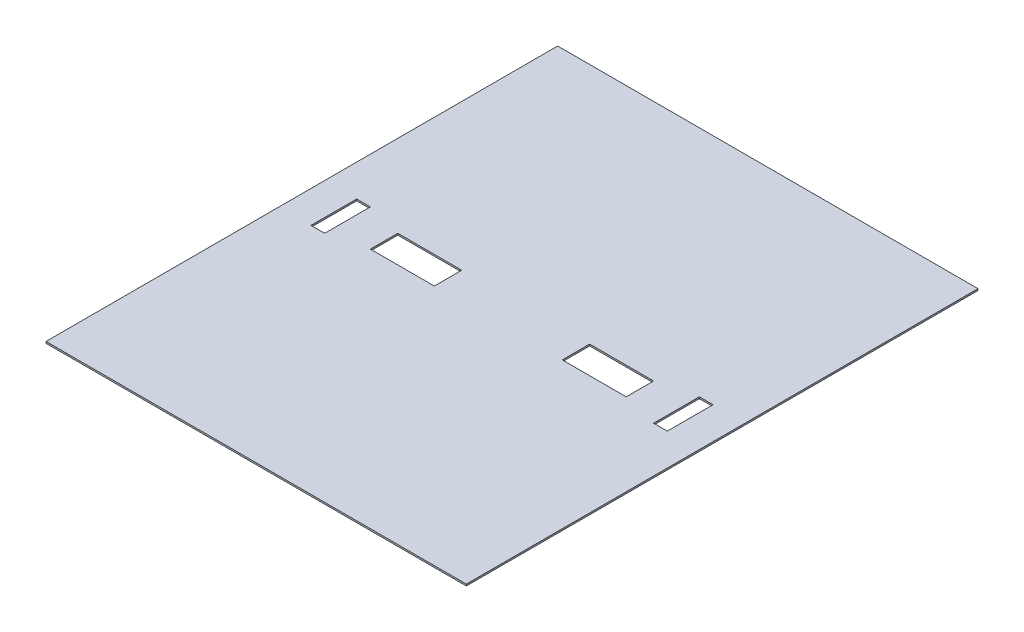
ISO-10303-21;
HEADER;
FILE_DESCRIPTION(('STEP AP214'),'2;1');
FILE_NAME('part.step','',(''),(''),'','','');
FILE_SCHEMA(('AUTOMOTIVE_DESIGN { 1 0 10303 214 1 1 1 1 }'));
ENDSEC;
DATA;
#1=APPLICATION_CONTEXT('core data for automotive mechanical design processes');
#2=APPLICATION_PROTOCOL_DEFINITION('international standard','automotive_design',2000,#1);
#3=PRODUCT_CONTEXT('',#1,'mechanical');
#4=PRODUCT('Part','Part','',(#3));
#5=PRODUCT_RELATED_PRODUCT_CATEGORY('part','',(#4));
#6=PRODUCT_DEFINITION_FORMATION('','',#4);
#7=PRODUCT_DEFINITION_CONTEXT('part definition',#1,'design');
#8=PRODUCT_DEFINITION('design','',#6,#7);
#9=PRODUCT_DEFINITION_SHAPE('','',#8);
#10=(LENGTH_UNIT() NAMED_UNIT(*) SI_UNIT(.MILLI.,.METRE.));
#11=(NAMED_UNIT(*) PLANE_ANGLE_UNIT() SI_UNIT($,.RADIAN.));
#12=(NAMED_UNIT(*) SI_UNIT($,.STERADIAN.) SOLID_ANGLE_UNIT());
#13=UNCERTAINTY_MEASURE_WITH_UNIT(LENGTH_MEASURE(1.E-05),#10,'distance_accuracy_value','');
#14=(GEOMETRIC_REPRESENTATION_CONTEXT(3) GLOBAL_UNCERTAINTY_ASSIGNED_CONTEXT((#13)) GLOBAL_UNIT_ASSIGNED_CONTEXT((#10,
#11,#12)) REPRESENTATION_CONTEXT('',''));
#15=CARTESIAN_POINT('',(0.,0.,0.));
#16=DIRECTION('',(0.,0.,1.));
#17=DIRECTION('',(1.,0.,0.));
#18=AXIS2_PLACEMENT_3D('',#15,#16,#17);
#19=CARTESIAN_POINT('',(0.,-27.6859999999999,0.));
#20=DIRECTION('',(0.,-1.,0.));
#21=DIRECTION('',(0.,0.,-1.));
#22=AXIS2_PLACEMENT_3D('',#19,#20,#21);
#23=PLANE('',#22);
#24=DIRECTION('',(0.,0.,-1.));
#25=VECTOR('',#24,1.);
#26=CARTESIAN_POINT('',(-247.65,-27.6859999999999,31.75));
#27=LINE('',#26,#25);
#28=CARTESIAN_POINT('',(-247.65,-27.6859999999999,31.75));
#29=VERTEX_POINT('',#28);
#30=CARTESIAN_POINT('',(-247.65,-27.6859999999999,-31.75));
#31=VERTEX_POINT('',#30);
#32=EDGE_CURVE('E255',#29,#31,#27,.T.);
#33=ORIENTED_EDGE('',*,*,#32,.F.);
#34=DIRECTION('',(-1.,0.,0.));
#35=VECTOR('',#34,1.);
#36=CARTESIAN_POINT('',(-247.65,-27.6859999999999,31.75));
#37=LINE('',#36,#35);
#38=CARTESIAN_POINT('',(-228.6,-27.6859999999999,31.75));
#39=VERTEX_POINT('',#38);
#40=EDGE_CURVE('E245',#39,#29,#37,.T.);
#41=ORIENTED_EDGE('',*,*,#40,.F.);
#42=DIRECTION('',(0.,0.,1.));
#43=VECTOR('',#42,1.);
#44=CARTESIAN_POINT('',(-228.6,-27.6859999999999,31.75));
#45=LINE('',#44,#43);
#46=CARTESIAN_POINT('',(-228.6,-27.6859999999999,-31.75));
#47=VERTEX_POINT('',#46);
#48=EDGE_CURVE('E261',#47,#39,#45,.T.);
#49=ORIENTED_EDGE('',*,*,#48,.F.);
#50=DIRECTION('',(1.,0.,0.));
#51=VECTOR('',#50,1.);
#52=CARTESIAN_POINT('',(-247.65,-27.6859999999999,-31.75));
#53=LINE('',#52,#51);
#54=EDGE_CURVE('E257',#31,#47,#53,.T.);
#55=ORIENTED_EDGE('',*,*,#54,.F.);
#56=EDGE_LOOP('',(#33,#41,#49,#55));
#57=FACE_BOUND('',#56,.T.);
#58=DIRECTION('',(0.,0.,-1.));
#59=VECTOR('',#58,1.);
#60=CARTESIAN_POINT('',(-177.8,-27.6859999999999,19.05));
#61=LINE('',#60,#59);
#62=CARTESIAN_POINT('',(-177.8,-27.6859999999999,19.05));
#63=VERTEX_POINT('',#62);
#64=CARTESIAN_POINT('',(-177.8,-27.6859999999999,-19.05));
#65=VERTEX_POINT('',#64);
#66=EDGE_CURVE('E211',#63,#65,#61,.T.);
#67=ORIENTED_EDGE('',*,*,#66,.F.);
#68=DIRECTION('',(-1.,0.,0.));
#69=VECTOR('',#68,1.);
#70=CARTESIAN_POINT('',(-177.8,-27.6859999999999,19.05));
#71=LINE('',#70,#69);
#72=CARTESIAN_POINT('',(-88.8999999999999,-27.6859999999999,19.05));
#73=VERTEX_POINT('',#72);
#74=EDGE_CURVE('E279',#73,#63,#71,.T.);
#75=ORIENTED_EDGE('',*,*,#74,.F.);
#76=DIRECTION('',(0.,0.,1.));
#77=VECTOR('',#76,1.);
#78=CARTESIAN_POINT('',(-88.8999999999999,-27.6859999999999,19.05));
#79=LINE('',#78,#77);
#80=CARTESIAN_POINT('',(-88.8999999999999,-27.6859999999999,-19.05));
#81=VERTEX_POINT('',#80);
#82=EDGE_CURVE('E293',#81,#73,#79,.T.);
#83=ORIENTED_EDGE('',*,*,#82,.F.);
#84=DIRECTION('',(1.,0.,0.));
#85=VECTOR('',#84,1.);
#86=CARTESIAN_POINT('',(-177.8,-27.6859999999999,-19.05));
#87=LINE('',#86,#85);
#88=EDGE_CURVE('E290',#65,#81,#87,.T.);
#89=ORIENTED_EDGE('',*,*,#88,.F.);
#90=EDGE_LOOP('',(#67,#75,#83,#89));
#91=FACE_BOUND('',#90,.T.);
#92=DIRECTION('',(0.,0.,1.));
#93=VECTOR('',#92,1.);
#94=CARTESIAN_POINT('',(-292.1,-27.6859999999999,-355.6));
#95=LINE('',#94,#93);
#96=CARTESIAN_POINT('',(-292.1,-27.6859999999999,-355.6));
#97=VERTEX_POINT('',#96);
#98=CARTESIAN_POINT('',(-292.1,-27.6859999999999,355.6));
#99=VERTEX_POINT('',#98);
#100=EDGE_CURVE('E305',#97,#99,#95,.T.);
#101=ORIENTED_EDGE('',*,*,#100,.F.);
#102=DIRECTION('',(-1.,0.,0.));
#103=VECTOR('',#102,1.);
#104=CARTESIAN_POINT('',(292.1,-27.6859999999999,-355.6));
#105=LINE('',#104,#103);
#106=CARTESIAN_POINT('',(292.1,-27.6859999999999,-355.6));
#107=VERTEX_POINT('',#106);
#108=EDGE_CURVE('E315',#107,#97,#105,.T.);
#109=ORIENTED_EDGE('',*,*,#108,.F.);
#110=DIRECTION('',(0.,0.,-1.));
#111=VECTOR('',#110,1.);
#112=CARTESIAN_POINT('',(292.1,-27.6859999999999,-355.6));
#113=LINE('',#112,#111);
#114=CARTESIAN_POINT('',(292.1,-27.6859999999999,355.6));
#115=VERTEX_POINT('',#114);
#116=EDGE_CURVE('E312',#115,#107,#113,.T.);
#117=ORIENTED_EDGE('',*,*,#116,.F.);
#118=DIRECTION('',(1.,0.,0.));
#119=VECTOR('',#118,1.);
#120=CARTESIAN_POINT('',(292.1,-27.6859999999999,355.6));
#121=LINE('',#120,#119);
#122=EDGE_CURVE('E308',#99,#115,#121,.T.);
#123=ORIENTED_EDGE('',*,*,#122,.F.);
#124=EDGE_LOOP('',(#101,#109,#117,#123));
#125=FACE_BOUND('',#124,.T.);
#126=DIRECTION('',(1.,0.,0.));
#127=VECTOR('',#126,1.);
#128=CARTESIAN_POINT('',(177.8,-27.6859999999999,19.05));
#129=LINE('',#128,#127);
#130=CARTESIAN_POINT('',(88.8999999999999,-27.6859999999999,19.05));
#131=VERTEX_POINT('',#130);
#132=CARTESIAN_POINT('',(177.8,-27.6859999999999,19.05));
#133=VERTEX_POINT('',#132);
#134=EDGE_CURVE('E227',#131,#133,#129,.T.);
#135=ORIENTED_EDGE('',*,*,#134,.T.);
#136=DIRECTION('',(0.,0.,-1.));
#137=VECTOR('',#136,1.);
#138=CARTESIAN_POINT('',(177.8,-27.6859999999999,19.05));
#139=LINE('',#138,#137);
#140=CARTESIAN_POINT('',(177.8,-27.6859999999999,-19.05));
#141=VERTEX_POINT('',#140);
#142=EDGE_CURVE('E60',#133,#141,#139,.T.);
#143=ORIENTED_EDGE('',*,*,#142,.T.);
#144=DIRECTION('',(-1.,0.,0.));
#145=VECTOR('',#144,1.);
#146=CARTESIAN_POINT('',(177.8,-27.6859999999999,-19.05));
#147=LINE('',#146,#145);
#148=CARTESIAN_POINT('',(88.8999999999999,-27.6859999999999,-19.05));
#149=VERTEX_POINT('',#148);
#150=EDGE_CURVE('E218',#141,#149,#147,.T.);
#151=ORIENTED_EDGE('',*,*,#150,.T.);
#152=DIRECTION('',(0.,0.,1.));
#153=VECTOR('',#152,1.);
#154=CARTESIAN_POINT('',(88.8999999999999,-27.6859999999999,19.05));
#155=LINE('',#154,#153);
#156=EDGE_CURVE('E230',#149,#131,#155,.T.);
#157=ORIENTED_EDGE('',*,*,#156,.T.);
#158=EDGE_LOOP('',(#135,#143,#151,#157));
#159=FACE_BOUND('',#158,.T.);
#160=DIRECTION('',(1.,0.,0.));
#161=VECTOR('',#160,1.);
#162=CARTESIAN_POINT('',(247.65,-27.6859999999999,31.75));
#163=LINE('',#162,#161);
#164=CARTESIAN_POINT('',(228.6,-27.6859999999999,31.75));
#165=VERTEX_POINT('',#164);
#166=CARTESIAN_POINT('',(247.65,-27.6859999999999,31.75));
#167=VERTEX_POINT('',#166);
#168=EDGE_CURVE('E204',#165,#167,#163,.T.);
#169=ORIENTED_EDGE('',*,*,#168,.T.);
#170=DIRECTION('',(0.,0.,-1.));
#171=VECTOR('',#170,1.);
#172=CARTESIAN_POINT('',(247.65,-27.6859999999999,31.75));
#173=LINE('',#172,#171);
#174=CARTESIAN_POINT('',(247.65,-27.6859999999999,-31.75));
#175=VERTEX_POINT('',#174);
#176=EDGE_CURVE('E52',#167,#175,#173,.T.);
#177=ORIENTED_EDGE('',*,*,#176,.T.);
#178=DIRECTION('',(-1.,0.,0.));
#179=VECTOR('',#178,1.);
#180=CARTESIAN_POINT('',(247.65,-27.6859999999999,-31.75));
#181=LINE('',#180,#179);
#182=CARTESIAN_POINT('',(228.6,-27.6859999999999,-31.75));
#183=VERTEX_POINT('',#182);
#184=EDGE_CURVE('E195',#175,#183,#181,.T.);
#185=ORIENTED_EDGE('',*,*,#184,.T.);
#186=DIRECTION('',(0.,0.,1.));
#187=VECTOR('',#186,1.);
#188=CARTESIAN_POINT('',(228.6,-27.6859999999999,31.75));
#189=LINE('',#188,#187);
#190=EDGE_CURVE('E198',#183,#165,#189,.T.);
#191=ORIENTED_EDGE('',*,*,#190,.T.);
#192=EDGE_LOOP('',(#169,#177,#185,#191));
#193=FACE_BOUND('',#192,.T.);
#194=ADVANCED_FACE('F35',(#57,#91,#125,#159,#193),#23,.T.);
#195=CARTESIAN_POINT('',(0.,-25.3999999999999,0.));
#196=DIRECTION('',(0.,-1.,0.));
#197=DIRECTION('',(0.,0.,-1.));
#198=AXIS2_PLACEMENT_3D('',#195,#196,#197);
#199=PLANE('',#198);
#200=DIRECTION('',(0.,0.,-1.));
#201=VECTOR('',#200,1.);
#202=CARTESIAN_POINT('',(177.8,-25.3999999999999,19.05));
#203=LINE('',#202,#201);
#204=CARTESIAN_POINT('',(177.8,-25.3999999999999,19.05));
#205=VERTEX_POINT('',#204);
#206=CARTESIAN_POINT('',(177.8,-25.3999999999999,-19.05));
#207=VERTEX_POINT('',#206);
#208=EDGE_CURVE('E215',#205,#207,#203,.T.);
#209=ORIENTED_EDGE('',*,*,#208,.F.);
#210=DIRECTION('',(1.,0.,0.));
#211=VECTOR('',#210,1.);
#212=CARTESIAN_POINT('',(177.8,-25.3999999999999,19.05));
#213=LINE('',#212,#211);
#214=CARTESIAN_POINT('',(88.8999999999999,-25.3999999999999,19.05));
#215=VERTEX_POINT('',#214);
#216=EDGE_CURVE('E217',#215,#205,#213,.T.);
#217=ORIENTED_EDGE('',*,*,#216,.F.);
#218=DIRECTION('',(0.,0.,1.));
#219=VECTOR('',#218,1.);
#220=CARTESIAN_POINT('',(88.8999999999999,-25.3999999999999,19.05));
#221=LINE('',#220,#219);
#222=CARTESIAN_POINT('',(88.8999999999999,-25.3999999999999,-19.05));
#223=VERTEX_POINT('',#222);
#224=EDGE_CURVE('E220',#223,#215,#221,.T.);
#225=ORIENTED_EDGE('',*,*,#224,.F.);
#226=DIRECTION('',(-1.,0.,0.));
#227=VECTOR('',#226,1.);
#228=CARTESIAN_POINT('',(177.8,-25.3999999999999,-19.05));
#229=LINE('',#228,#227);
#230=EDGE_CURVE('E223',#207,#223,#229,.T.);
#231=ORIENTED_EDGE('',*,*,#230,.F.);
#232=EDGE_LOOP('',(#209,#217,#225,#231));
#233=FACE_BOUND('',#232,.T.);
#234=DIRECTION('',(-1.,0.,0.));
#235=VECTOR('',#234,1.);
#236=CARTESIAN_POINT('',(-247.65,-25.3999999999999,31.75));
#237=LINE('',#236,#235);
#238=CARTESIAN_POINT('',(-228.6,-25.3999999999999,31.75));
#239=VERTEX_POINT('',#238);
#240=CARTESIAN_POINT('',(-247.65,-25.3999999999999,31.75));
#241=VERTEX_POINT('',#240);
#242=EDGE_CURVE('E251',#239,#241,#237,.T.);
#243=ORIENTED_EDGE('',*,*,#242,.T.);
#244=DIRECTION('',(0.,0.,-1.));
#245=VECTOR('',#244,1.);
#246=CARTESIAN_POINT('',(-247.65,-25.3999999999999,31.75));
#247=LINE('',#246,#245);
#248=CARTESIAN_POINT('',(-247.65,-25.3999999999999,-31.75));
#249=VERTEX_POINT('',#248);
#250=EDGE_CURVE('E241',#241,#249,#247,.T.);
#251=ORIENTED_EDGE('',*,*,#250,.T.);
#252=DIRECTION('',(1.,0.,0.));
#253=VECTOR('',#252,1.);
#254=CARTESIAN_POINT('',(-247.65,-25.3999999999999,-31.75));
#255=LINE('',#254,#253);
#256=CARTESIAN_POINT('',(-228.6,-25.3999999999999,-31.75));
#257=VERTEX_POINT('',#256);
#258=EDGE_CURVE('E244',#249,#257,#255,.T.);
#259=ORIENTED_EDGE('',*,*,#258,.T.);
#260=DIRECTION('',(0.,0.,1.));
#261=VECTOR('',#260,1.);
#262=CARTESIAN_POINT('',(-228.6,-25.3999999999999,31.75));
#263=LINE('',#262,#261);
#264=EDGE_CURVE('E248',#257,#239,#263,.T.);
#265=ORIENTED_EDGE('',*,*,#264,.T.);
#266=EDGE_LOOP('',(#243,#251,#259,#265));
#267=FACE_BOUND('',#266,.T.);
#268=DIRECTION('',(-1.,0.,0.));
#269=VECTOR('',#268,1.);
#270=CARTESIAN_POINT('',(-177.8,-25.3999999999999,19.05));
#271=LINE('',#270,#269);
#272=CARTESIAN_POINT('',(-88.8999999999999,-25.3999999999999,19.05));
#273=VERTEX_POINT('',#272);
#274=CARTESIAN_POINT('',(-177.8,-25.3999999999999,19.05));
#275=VERTEX_POINT('',#274);
#276=EDGE_CURVE('E285',#273,#275,#271,.T.);
#277=ORIENTED_EDGE('',*,*,#276,.T.);
#278=DIRECTION('',(0.,0.,-1.));
#279=VECTOR('',#278,1.);
#280=CARTESIAN_POINT('',(-177.8,-25.3999999999999,19.05));
#281=LINE('',#280,#279);
#282=CARTESIAN_POINT('',(-177.8,-25.3999999999999,-19.05));
#283=VERTEX_POINT('',#282);
#284=EDGE_CURVE('E275',#275,#283,#281,.T.);
#285=ORIENTED_EDGE('',*,*,#284,.T.);
#286=DIRECTION('',(1.,0.,0.));
#287=VECTOR('',#286,1.);
#288=CARTESIAN_POINT('',(-177.8,-25.3999999999999,-19.05));
#289=LINE('',#288,#287);
#290=CARTESIAN_POINT('',(-88.8999999999999,-25.3999999999999,-19.05));
#291=VERTEX_POINT('',#290);
#292=EDGE_CURVE('E278',#283,#291,#289,.T.);
#293=ORIENTED_EDGE('',*,*,#292,.T.);
#294=DIRECTION('',(0.,0.,1.));
#295=VECTOR('',#294,1.);
#296=CARTESIAN_POINT('',(-88.8999999999999,-25.3999999999999,19.05));
#297=LINE('',#296,#295);
#298=EDGE_CURVE('E282',#291,#273,#297,.T.);
#299=ORIENTED_EDGE('',*,*,#298,.T.);
#300=EDGE_LOOP('',(#277,#285,#293,#299));
#301=FACE_BOUND('',#300,.T.);
#302=DIRECTION('',(0.,0.,1.));
#303=VECTOR('',#302,1.);
#304=CARTESIAN_POINT('',(-292.1,-25.3999999999999,-355.6));
#305=LINE('',#304,#303);
#306=CARTESIAN_POINT('',(-292.1,-25.3999999999999,-355.6));
#307=VERTEX_POINT('',#306);
#308=CARTESIAN_POINT('',(-292.1,-25.3999999999999,355.6));
#309=VERTEX_POINT('',#308);
#310=EDGE_CURVE('E268',#307,#309,#305,.T.);
#311=ORIENTED_EDGE('',*,*,#310,.T.);
#312=DIRECTION('',(1.,0.,0.));
#313=VECTOR('',#312,1.);
#314=CARTESIAN_POINT('',(292.1,-25.3999999999999,355.6));
#315=LINE('',#314,#313);
#316=CARTESIAN_POINT('',(292.1,-25.3999999999999,355.6));
#317=VERTEX_POINT('',#316);
#318=EDGE_CURVE('E320',#309,#317,#315,.T.);
#319=ORIENTED_EDGE('',*,*,#318,.T.);
#320=DIRECTION('',(0.,0.,-1.));
#321=VECTOR('',#320,1.);
#322=CARTESIAN_POINT('',(292.1,-25.3999999999999,-355.6));
#323=LINE('',#322,#321);
#324=CARTESIAN_POINT('',(292.1,-25.3999999999999,-355.6));
#325=VERTEX_POINT('',#324);
#326=EDGE_CURVE('E323',#317,#325,#323,.T.);
#327=ORIENTED_EDGE('',*,*,#326,.T.);
#328=DIRECTION('',(-1.,0.,0.));
#329=VECTOR('',#328,1.);
#330=CARTESIAN_POINT('',(292.1,-25.3999999999999,-355.6));
#331=LINE('',#330,#329);
#332=EDGE_CURVE('E309',#325,#307,#331,.T.);
#333=ORIENTED_EDGE('',*,*,#332,.T.);
#334=EDGE_LOOP('',(#311,#319,#327,#333));
#335=FACE_BOUND('',#334,.T.);
#336=DIRECTION('',(0.,0.,-1.));
#337=VECTOR('',#336,1.);
#338=CARTESIAN_POINT('',(247.65,-25.3999999999999,31.75));
#339=LINE('',#338,#337);
#340=CARTESIAN_POINT('',(247.65,-25.3999999999999,31.75));
#341=VERTEX_POINT('',#340);
#342=CARTESIAN_POINT('',(247.65,-25.3999999999999,-31.75));
#343=VERTEX_POINT('',#342);
#344=EDGE_CURVE('E187',#341,#343,#339,.T.);
#345=ORIENTED_EDGE('',*,*,#344,.F.);
#346=DIRECTION('',(1.,0.,0.));
#347=VECTOR('',#346,1.);
#348=CARTESIAN_POINT('',(247.65,-25.3999999999999,31.75));
#349=LINE('',#348,#347);
#350=CARTESIAN_POINT('',(228.6,-25.3999999999999,31.75));
#351=VERTEX_POINT('',#350);
#352=EDGE_CURVE('E176',#351,#341,#349,.T.);
#353=ORIENTED_EDGE('',*,*,#352,.F.);
#354=DIRECTION('',(0.,0.,1.));
#355=VECTOR('',#354,1.);
#356=CARTESIAN_POINT('',(228.6,-25.3999999999999,31.75));
#357=LINE('',#356,#355);
#358=CARTESIAN_POINT('',(228.6,-25.3999999999999,-31.75));
#359=VERTEX_POINT('',#358);
#360=EDGE_CURVE('E186',#359,#351,#357,.T.);
#361=ORIENTED_EDGE('',*,*,#360,.F.);
#362=DIRECTION('',(-1.,0.,0.));
#363=VECTOR('',#362,1.);
#364=CARTESIAN_POINT('',(247.65,-25.3999999999999,-31.75));
#365=LINE('',#364,#363);
#366=EDGE_CURVE('E191',#343,#359,#365,.T.);
#367=ORIENTED_EDGE('',*,*,#366,.F.);
#368=EDGE_LOOP('',(#345,#353,#361,#367));
#369=FACE_BOUND('',#368,.T.);
#370=ADVANCED_FACE('F194',(#233,#267,#301,#335,#369),#199,.F.);
#371=CARTESIAN_POINT('',(-292.1,-27.6859999999999,-355.6));
#372=DIRECTION('',(-1.,0.,0.));
#373=DIRECTION('',(0.,0.,1.));
#374=AXIS2_PLACEMENT_3D('',#371,#372,#373);
#375=PLANE('',#374);
#376=ORIENTED_EDGE('',*,*,#310,.F.);
#377=DIRECTION('',(0.,1.,0.));
#378=VECTOR('',#377,1.);
#379=CARTESIAN_POINT('',(-292.1,-27.6859999999999,-355.6));
#380=LINE('',#379,#378);
#381=EDGE_CURVE('E11',#97,#307,#380,.T.);
#382=ORIENTED_EDGE('',*,*,#381,.F.);
#383=ORIENTED_EDGE('',*,*,#100,.T.);
#384=DIRECTION('',(0.,1.,0.));
#385=VECTOR('',#384,1.);
#386=CARTESIAN_POINT('',(-292.1,-27.6859999999999,355.6));
#387=LINE('',#386,#385);
#388=EDGE_CURVE('E39',#99,#309,#387,.T.);
#389=ORIENTED_EDGE('',*,*,#388,.T.);
#390=EDGE_LOOP('',(#376,#382,#383,#389));
#391=FACE_BOUND('',#390,.T.);
#392=ADVANCED_FACE('F37',(#391),#375,.T.);
#393=CARTESIAN_POINT('',(292.1,-27.6859999999999,-355.6));
#394=DIRECTION('',(0.,0.,-1.));
#395=DIRECTION('',(-1.,0.,0.));
#396=AXIS2_PLACEMENT_3D('',#393,#394,#395);
#397=PLANE('',#396);
#398=ORIENTED_EDGE('',*,*,#332,.F.);
#399=DIRECTION('',(0.,1.,0.));
#400=VECTOR('',#399,1.);
#401=CARTESIAN_POINT('',(292.1,-27.6859999999999,-355.6));
#402=LINE('',#401,#400);
#403=EDGE_CURVE('E44',#107,#325,#402,.T.);
#404=ORIENTED_EDGE('',*,*,#403,.F.);
#405=ORIENTED_EDGE('',*,*,#108,.T.);
#406=ORIENTED_EDGE('',*,*,#381,.T.);
#407=EDGE_LOOP('',(#398,#404,#405,#406));
#408=FACE_BOUND('',#407,.T.);
#409=ADVANCED_FACE('F340',(#408),#397,.T.);
#410=CARTESIAN_POINT('',(292.1,-27.6859999999999,-355.6));
#411=DIRECTION('',(1.,0.,0.));
#412=DIRECTION('',(0.,0.,-1.));
#413=AXIS2_PLACEMENT_3D('',#410,#411,#412);
#414=PLANE('',#413);
#415=ORIENTED_EDGE('',*,*,#326,.F.);
#416=DIRECTION('',(0.,1.,0.));
#417=VECTOR('',#416,1.);
#418=CARTESIAN_POINT('',(292.1,-27.6859999999999,355.6));
#419=LINE('',#418,#417);
#420=EDGE_CURVE('E328',#115,#317,#419,.T.);
#421=ORIENTED_EDGE('',*,*,#420,.F.);
#422=ORIENTED_EDGE('',*,*,#116,.T.);
#423=ORIENTED_EDGE('',*,*,#403,.T.);
#424=EDGE_LOOP('',(#415,#421,#422,#423));
#425=FACE_BOUND('',#424,.T.);
#426=ADVANCED_FACE('F346',(#425),#414,.T.);
#427=CARTESIAN_POINT('',(292.1,-27.6859999999999,355.6));
#428=DIRECTION('',(0.,0.,1.));
#429=DIRECTION('',(1.,0.,0.));
#430=AXIS2_PLACEMENT_3D('',#427,#428,#429);
#431=PLANE('',#430);
#432=ORIENTED_EDGE('',*,*,#318,.F.);
#433=ORIENTED_EDGE('',*,*,#388,.F.);
#434=ORIENTED_EDGE('',*,*,#122,.T.);
#435=ORIENTED_EDGE('',*,*,#420,.T.);
#436=EDGE_LOOP('',(#432,#433,#434,#435));
#437=FACE_BOUND('',#436,.T.);
#438=ADVANCED_FACE('F336',(#437),#431,.T.);
#439=CARTESIAN_POINT('',(-177.8,-25.3999999999999,19.05));
#440=DIRECTION('',(-1.,0.,0.));
#441=DIRECTION('',(0.,0.,1.));
#442=AXIS2_PLACEMENT_3D('',#439,#440,#441);
#443=PLANE('',#442);
#444=ORIENTED_EDGE('',*,*,#66,.T.);
#445=DIRECTION('',(0.,-1.,0.));
#446=VECTOR('',#445,1.);
#447=CARTESIAN_POINT('',(-177.8,-25.3999999999999,-19.05));
#448=LINE('',#447,#446);
#449=EDGE_CURVE('E288',#283,#65,#448,.T.);
#450=ORIENTED_EDGE('',*,*,#449,.F.);
#451=ORIENTED_EDGE('',*,*,#284,.F.);
#452=DIRECTION('',(0.,-1.,0.));
#453=VECTOR('',#452,1.);
#454=CARTESIAN_POINT('',(-177.8,-25.3999999999999,19.05));
#455=LINE('',#454,#453);
#456=EDGE_CURVE('E258',#275,#63,#455,.T.);
#457=ORIENTED_EDGE('',*,*,#456,.T.);
#458=EDGE_LOOP('',(#444,#450,#451,#457));
#459=FACE_BOUND('',#458,.T.);
#460=ADVANCED_FACE('F353',(#459),#443,.F.);
#461=CARTESIAN_POINT('',(-177.8,-25.3999999999999,19.05));
#462=DIRECTION('',(0.,0.,1.));
#463=DIRECTION('',(1.,0.,0.));
#464=AXIS2_PLACEMENT_3D('',#461,#462,#463);
#465=PLANE('',#464);
#466=ORIENTED_EDGE('',*,*,#74,.T.);
#467=ORIENTED_EDGE('',*,*,#456,.F.);
#468=ORIENTED_EDGE('',*,*,#276,.F.);
#469=DIRECTION('',(0.,-1.,0.));
#470=VECTOR('',#469,1.);
#471=CARTESIAN_POINT('',(-88.8999999999999,-25.3999999999999,19.05));
#472=LINE('',#471,#470);
#473=EDGE_CURVE('E299',#273,#73,#472,.T.);
#474=ORIENTED_EDGE('',*,*,#473,.T.);
#475=EDGE_LOOP('',(#466,#467,#468,#474));
#476=FACE_BOUND('',#475,.T.);
#477=ADVANCED_FACE('F368',(#476),#465,.F.);
#478=CARTESIAN_POINT('',(-88.8999999999999,-25.3999999999999,19.05));
#479=DIRECTION('',(1.,0.,0.));
#480=DIRECTION('',(0.,0.,-1.));
#481=AXIS2_PLACEMENT_3D('',#478,#479,#480);
#482=PLANE('',#481);
#483=ORIENTED_EDGE('',*,*,#82,.T.);
#484=ORIENTED_EDGE('',*,*,#473,.F.);
#485=ORIENTED_EDGE('',*,*,#298,.F.);
#486=DIRECTION('',(0.,-1.,0.));
#487=VECTOR('',#486,1.);
#488=CARTESIAN_POINT('',(-88.8999999999999,-25.3999999999999,-19.05));
#489=LINE('',#488,#487);
#490=EDGE_CURVE('E301',#291,#81,#489,.T.);
#491=ORIENTED_EDGE('',*,*,#490,.T.);
#492=EDGE_LOOP('',(#483,#484,#485,#491));
#493=FACE_BOUND('',#492,.T.);
#494=ADVANCED_FACE('F374',(#493),#482,.F.);
#495=CARTESIAN_POINT('',(-177.8,-25.3999999999999,-19.05));
#496=DIRECTION('',(0.,0.,-1.));
#497=DIRECTION('',(-1.,0.,0.));
#498=AXIS2_PLACEMENT_3D('',#495,#496,#497);
#499=PLANE('',#498);
#500=ORIENTED_EDGE('',*,*,#88,.T.);
#501=ORIENTED_EDGE('',*,*,#490,.F.);
#502=ORIENTED_EDGE('',*,*,#292,.F.);
#503=ORIENTED_EDGE('',*,*,#449,.T.);
#504=EDGE_LOOP('',(#500,#501,#502,#503));
#505=FACE_BOUND('',#504,.T.);
#506=ADVANCED_FACE('F370',(#505),#499,.F.);
#507=CARTESIAN_POINT('',(-247.65,-25.3999999999999,31.75));
#508=DIRECTION('',(-1.,0.,0.));
#509=DIRECTION('',(0.,0.,1.));
#510=AXIS2_PLACEMENT_3D('',#507,#508,#509);
#511=PLANE('',#510);
#512=ORIENTED_EDGE('',*,*,#32,.T.);
#513=DIRECTION('',(0.,-1.,0.));
#514=VECTOR('',#513,1.);
#515=CARTESIAN_POINT('',(-247.65,-25.3999999999999,-31.75));
#516=LINE('',#515,#514);
#517=EDGE_CURVE('E254',#249,#31,#516,.T.);
#518=ORIENTED_EDGE('',*,*,#517,.F.);
#519=ORIENTED_EDGE('',*,*,#250,.F.);
#520=DIRECTION('',(0.,-1.,0.));
#521=VECTOR('',#520,1.);
#522=CARTESIAN_POINT('',(-247.65,-25.3999999999999,31.75));
#523=LINE('',#522,#521);
#524=EDGE_CURVE('E266',#241,#29,#523,.T.);
#525=ORIENTED_EDGE('',*,*,#524,.T.);
#526=EDGE_LOOP('',(#512,#518,#519,#525));
#527=FACE_BOUND('',#526,.T.);
#528=ADVANCED_FACE('F373',(#527),#511,.F.);
#529=CARTESIAN_POINT('',(-247.65,-25.3999999999999,31.75));
#530=DIRECTION('',(0.,0.,1.));
#531=DIRECTION('',(1.,0.,0.));
#532=AXIS2_PLACEMENT_3D('',#529,#530,#531);
#533=PLANE('',#532);
#534=ORIENTED_EDGE('',*,*,#40,.T.);
#535=ORIENTED_EDGE('',*,*,#524,.F.);
#536=ORIENTED_EDGE('',*,*,#242,.F.);
#537=DIRECTION('',(0.,-1.,0.));
#538=VECTOR('',#537,1.);
#539=CARTESIAN_POINT('',(-228.6,-25.3999999999999,31.75));
#540=LINE('',#539,#538);
#541=EDGE_CURVE('E269',#239,#39,#540,.T.);
#542=ORIENTED_EDGE('',*,*,#541,.T.);
#543=EDGE_LOOP('',(#534,#535,#536,#542));
#544=FACE_BOUND('',#543,.T.);
#545=ADVANCED_FACE('F384',(#544),#533,.F.);
#546=CARTESIAN_POINT('',(-228.6,-25.3999999999999,31.75));
#547=DIRECTION('',(1.,0.,0.));
#548=DIRECTION('',(0.,0.,-1.));
#549=AXIS2_PLACEMENT_3D('',#546,#547,#548);
#550=PLANE('',#549);
#551=ORIENTED_EDGE('',*,*,#48,.T.);
#552=ORIENTED_EDGE('',*,*,#541,.F.);
#553=ORIENTED_EDGE('',*,*,#264,.F.);
#554=DIRECTION('',(0.,-1.,0.));
#555=VECTOR('',#554,1.);
#556=CARTESIAN_POINT('',(-228.6,-25.3999999999999,-31.75));
#557=LINE('',#556,#555);
#558=EDGE_CURVE('E271',#257,#47,#557,.T.);
#559=ORIENTED_EDGE('',*,*,#558,.T.);
#560=EDGE_LOOP('',(#551,#552,#553,#559));
#561=FACE_BOUND('',#560,.T.);
#562=ADVANCED_FACE('F390',(#561),#550,.F.);
#563=CARTESIAN_POINT('',(-247.65,-25.3999999999999,-31.75));
#564=DIRECTION('',(0.,0.,-1.));
#565=DIRECTION('',(-1.,0.,0.));
#566=AXIS2_PLACEMENT_3D('',#563,#564,#565);
#567=PLANE('',#566);
#568=ORIENTED_EDGE('',*,*,#54,.T.);
#569=ORIENTED_EDGE('',*,*,#558,.F.);
#570=ORIENTED_EDGE('',*,*,#258,.F.);
#571=ORIENTED_EDGE('',*,*,#517,.T.);
#572=EDGE_LOOP('',(#568,#569,#570,#571));
#573=FACE_BOUND('',#572,.T.);
#574=ADVANCED_FACE('F386',(#573),#567,.F.);
#575=CARTESIAN_POINT('',(177.8,-25.3999999999999,19.05));
#576=DIRECTION('',(-1.,0.,0.));
#577=DIRECTION('',(0.,0.,1.));
#578=AXIS2_PLACEMENT_3D('',#575,#576,#577);
#579=PLANE('',#578);
#580=ORIENTED_EDGE('',*,*,#142,.F.);
#581=DIRECTION('',(0.,-1.,0.));
#582=VECTOR('',#581,1.);
#583=CARTESIAN_POINT('',(177.8,-25.3999999999999,19.05));
#584=LINE('',#583,#582);
#585=EDGE_CURVE('E225',#205,#133,#584,.T.);
#586=ORIENTED_EDGE('',*,*,#585,.F.);
#587=ORIENTED_EDGE('',*,*,#208,.T.);
#588=DIRECTION('',(0.,-1.,0.));
#589=VECTOR('',#588,1.);
#590=CARTESIAN_POINT('',(177.8,-25.3999999999999,-19.05));
#591=LINE('',#590,#589);
#592=EDGE_CURVE('E205',#207,#141,#591,.T.);
#593=ORIENTED_EDGE('',*,*,#592,.T.);
#594=EDGE_LOOP('',(#580,#586,#587,#593));
#595=FACE_BOUND('',#594,.T.);
#596=ADVANCED_FACE('F389',(#595),#579,.T.);
#597=CARTESIAN_POINT('',(177.8,-25.3999999999999,-19.05));
#598=DIRECTION('',(0.,0.,1.));
#599=DIRECTION('',(1.,0.,0.));
#600=AXIS2_PLACEMENT_3D('',#597,#598,#599);
#601=PLANE('',#600);
#602=ORIENTED_EDGE('',*,*,#150,.F.);
#603=ORIENTED_EDGE('',*,*,#592,.F.);
#604=ORIENTED_EDGE('',*,*,#230,.T.);
#605=DIRECTION('',(0.,-1.,0.));
#606=VECTOR('',#605,1.);
#607=CARTESIAN_POINT('',(88.8999999999999,-25.3999999999999,-19.05));
#608=LINE('',#607,#606);
#609=EDGE_CURVE('E236',#223,#149,#608,.T.);
#610=ORIENTED_EDGE('',*,*,#609,.T.);
#611=EDGE_LOOP('',(#602,#603,#604,#610));
#612=FACE_BOUND('',#611,.T.);
#613=ADVANCED_FACE('F400',(#612),#601,.T.);
#614=CARTESIAN_POINT('',(88.8999999999999,-25.3999999999999,19.05));
#615=DIRECTION('',(1.,0.,0.));
#616=DIRECTION('',(0.,0.,-1.));
#617=AXIS2_PLACEMENT_3D('',#614,#615,#616);
#618=PLANE('',#617);
#619=ORIENTED_EDGE('',*,*,#156,.F.);
#620=ORIENTED_EDGE('',*,*,#609,.F.);
#621=ORIENTED_EDGE('',*,*,#224,.T.);
#622=DIRECTION('',(0.,-1.,0.));
#623=VECTOR('',#622,1.);
#624=CARTESIAN_POINT('',(88.8999999999999,-25.3999999999999,19.05));
#625=LINE('',#624,#623);
#626=EDGE_CURVE('E238',#215,#131,#625,.T.);
#627=ORIENTED_EDGE('',*,*,#626,.T.);
#628=EDGE_LOOP('',(#619,#620,#621,#627));
#629=FACE_BOUND('',#628,.T.);
#630=ADVANCED_FACE('F404',(#629),#618,.T.);
#631=CARTESIAN_POINT('',(177.8,-25.3999999999999,19.05));
#632=DIRECTION('',(0.,0.,-1.));
#633=DIRECTION('',(-1.,0.,0.));
#634=AXIS2_PLACEMENT_3D('',#631,#632,#633);
#635=PLANE('',#634);
#636=ORIENTED_EDGE('',*,*,#134,.F.);
#637=ORIENTED_EDGE('',*,*,#626,.F.);
#638=ORIENTED_EDGE('',*,*,#216,.T.);
#639=ORIENTED_EDGE('',*,*,#585,.T.);
#640=EDGE_LOOP('',(#636,#637,#638,#639));
#641=FACE_BOUND('',#640,.T.);
#642=ADVANCED_FACE('F401',(#641),#635,.T.);
#643=CARTESIAN_POINT('',(247.65,-25.3999999999999,31.75));
#644=DIRECTION('',(-1.,0.,0.));
#645=DIRECTION('',(0.,0.,1.));
#646=AXIS2_PLACEMENT_3D('',#643,#644,#645);
#647=PLANE('',#646);
#648=ORIENTED_EDGE('',*,*,#176,.F.);
#649=DIRECTION('',(0.,-1.,0.));
#650=VECTOR('',#649,1.);
#651=CARTESIAN_POINT('',(247.65,-25.3999999999999,31.75));
#652=LINE('',#651,#650);
#653=EDGE_CURVE('E179',#341,#167,#652,.T.);
#654=ORIENTED_EDGE('',*,*,#653,.F.);
#655=ORIENTED_EDGE('',*,*,#344,.T.);
#656=DIRECTION('',(0.,-1.,0.));
#657=VECTOR('',#656,1.);
#658=CARTESIAN_POINT('',(247.65,-25.3999999999999,-31.75));
#659=LINE('',#658,#657);
#660=EDGE_CURVE('E209',#343,#175,#659,.T.);
#661=ORIENTED_EDGE('',*,*,#660,.T.);
#662=EDGE_LOOP('',(#648,#654,#655,#661));
#663=FACE_BOUND('',#662,.T.);
#664=ADVANCED_FACE('F189',(#663),#647,.T.);
#665=CARTESIAN_POINT('',(247.65,-25.3999999999999,-31.75));
#666=DIRECTION('',(0.,0.,1.));
#667=DIRECTION('',(1.,0.,0.));
#668=AXIS2_PLACEMENT_3D('',#665,#666,#667);
#669=PLANE('',#668);
#670=ORIENTED_EDGE('',*,*,#184,.F.);
#671=ORIENTED_EDGE('',*,*,#660,.F.);
#672=ORIENTED_EDGE('',*,*,#366,.T.);
#673=DIRECTION('',(0.,-1.,0.));
#674=VECTOR('',#673,1.);
#675=CARTESIAN_POINT('',(228.6,-25.3999999999999,-31.75));
#676=LINE('',#675,#674);
#677=EDGE_CURVE('E212',#359,#183,#676,.T.);
#678=ORIENTED_EDGE('',*,*,#677,.T.);
#679=EDGE_LOOP('',(#670,#671,#672,#678));
#680=FACE_BOUND('',#679,.T.);
#681=ADVANCED_FACE('F414',(#680),#669,.T.);
#682=CARTESIAN_POINT('',(228.6,-25.3999999999999,31.75));
#683=DIRECTION('',(1.,0.,0.));
#684=DIRECTION('',(0.,0.,-1.));
#685=AXIS2_PLACEMENT_3D('',#682,#683,#684);
#686=PLANE('',#685);
#687=ORIENTED_EDGE('',*,*,#190,.F.);
#688=ORIENTED_EDGE('',*,*,#677,.F.);
#689=ORIENTED_EDGE('',*,*,#360,.T.);
#690=DIRECTION('',(0.,-1.,0.));
#691=VECTOR('',#690,1.);
#692=CARTESIAN_POINT('',(228.6,-25.3999999999999,31.75));
#693=LINE('',#692,#691);
#694=EDGE_CURVE('E181',#351,#165,#693,.T.);
#695=ORIENTED_EDGE('',*,*,#694,.T.);
#696=EDGE_LOOP('',(#687,#688,#689,#695));
#697=FACE_BOUND('',#696,.T.);
#698=ADVANCED_FACE('F417',(#697),#686,.T.);
#699=CARTESIAN_POINT('',(247.65,-25.3999999999999,31.75));
#700=DIRECTION('',(0.,0.,-1.));
#701=DIRECTION('',(-1.,0.,0.));
#702=AXIS2_PLACEMENT_3D('',#699,#700,#701);
#703=PLANE('',#702);
#704=ORIENTED_EDGE('',*,*,#168,.F.);
#705=ORIENTED_EDGE('',*,*,#694,.F.);
#706=ORIENTED_EDGE('',*,*,#352,.T.);
#707=ORIENTED_EDGE('',*,*,#653,.T.);
#708=EDGE_LOOP('',(#704,#705,#706,#707));
#709=FACE_BOUND('',#708,.T.);
#710=ADVANCED_FACE('F178',(#709),#703,.T.);
#711=CLOSED_SHELL('',(#194,#370,#392,#409,#426,#438,#460,#477,#494,#506,#528,#545,#562,#574,
#596,#613,#630,#642,#664,#681,#698,#710));
#712=MANIFOLD_SOLID_BREP('B2',#711);
#713=ADVANCED_BREP_SHAPE_REPRESENTATION('',(#18,#712),#14);
#714=SHAPE_DEFINITION_REPRESENTATION(#9,#713);
ENDSEC;
END-ISO-10303-21;
